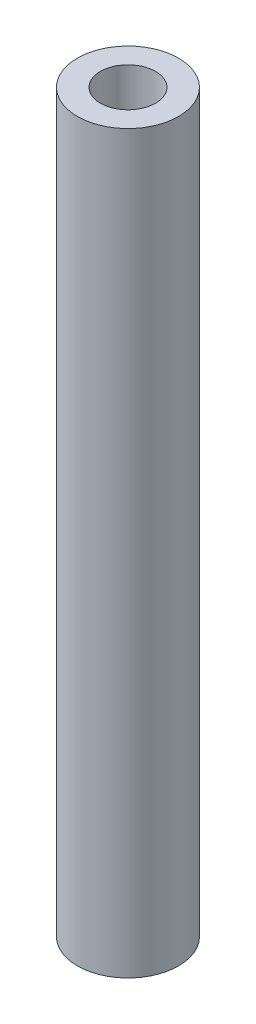
ISO-10303-21;
HEADER;
FILE_DESCRIPTION(('STEP AP214'),'2;1');
FILE_NAME('part.step','',(''),(''),'','','');
FILE_SCHEMA(('AUTOMOTIVE_DESIGN { 1 0 10303 214 1 1 1 1 }'));
ENDSEC;
DATA;
#1=APPLICATION_CONTEXT('core data for automotive mechanical design processes');
#2=APPLICATION_PROTOCOL_DEFINITION('international standard','automotive_design',2000,#1);
#3=PRODUCT_CONTEXT('',#1,'mechanical');
#4=PRODUCT('Part','Part','',(#3));
#5=PRODUCT_RELATED_PRODUCT_CATEGORY('part','',(#4));
#6=PRODUCT_DEFINITION_FORMATION('','',#4);
#7=PRODUCT_DEFINITION_CONTEXT('part definition',#1,'design');
#8=PRODUCT_DEFINITION('design','',#6,#7);
#9=PRODUCT_DEFINITION_SHAPE('','',#8);
#10=(LENGTH_UNIT() NAMED_UNIT(*) SI_UNIT(.MILLI.,.METRE.));
#11=(NAMED_UNIT(*) PLANE_ANGLE_UNIT() SI_UNIT($,.RADIAN.));
#12=(NAMED_UNIT(*) SI_UNIT($,.STERADIAN.) SOLID_ANGLE_UNIT());
#13=UNCERTAINTY_MEASURE_WITH_UNIT(LENGTH_MEASURE(1.E-05),#10,'distance_accuracy_value','');
#14=(GEOMETRIC_REPRESENTATION_CONTEXT(3) GLOBAL_UNCERTAINTY_ASSIGNED_CONTEXT((#13)) GLOBAL_UNIT_ASSIGNED_CONTEXT((#10,
#11,#12)) REPRESENTATION_CONTEXT('',''));
#15=CARTESIAN_POINT('',(0.,0.,0.));
#16=DIRECTION('',(0.,0.,1.));
#17=DIRECTION('',(1.,0.,0.));
#18=AXIS2_PLACEMENT_3D('',#15,#16,#17);
#19=CARTESIAN_POINT('',(0.,40.,0.));
#20=DIRECTION('',(0.,1.,0.));
#21=DIRECTION('',(0.,0.,1.));
#22=AXIS2_PLACEMENT_3D('',#19,#20,#21);
#23=PLANE('',#22);
#24=CARTESIAN_POINT('',(0.,40.,0.));
#25=DIRECTION('',(0.,1.,0.));
#26=DIRECTION('',(0.,0.,1.));
#27=AXIS2_PLACEMENT_3D('',#24,#25,#26);
#28=CIRCLE('',#27,2.75);
#29=CARTESIAN_POINT('',(0.,40.,2.75));
#30=VERTEX_POINT('',#29);
#31=EDGE_CURVE('E10',#30,#30,#28,.T.);
#32=ORIENTED_EDGE('',*,*,#31,.T.);
#33=EDGE_LOOP('',(#32));
#34=FACE_BOUND('',#33,.T.);
#35=CARTESIAN_POINT('',(0.,40.,0.));
#36=DIRECTION('',(0.,1.,0.));
#37=DIRECTION('',(0.,0.,1.));
#38=AXIS2_PLACEMENT_3D('',#35,#36,#37);
#39=CIRCLE('',#38,1.5);
#40=CARTESIAN_POINT('',(0.,40.,1.5));
#41=VERTEX_POINT('',#40);
#42=EDGE_CURVE('E54',#41,#41,#39,.T.);
#43=ORIENTED_EDGE('',*,*,#42,.F.);
#44=EDGE_LOOP('',(#43));
#45=FACE_BOUND('',#44,.T.);
#46=ADVANCED_FACE('F41',(#34,#45),#23,.T.);
#47=CARTESIAN_POINT('',(0.,0.,0.));
#48=DIRECTION('',(0.,1.,0.));
#49=DIRECTION('',(0.,0.,1.));
#50=AXIS2_PLACEMENT_3D('',#47,#48,#49);
#51=PLANE('',#50);
#52=CARTESIAN_POINT('',(0.,0.,0.));
#53=DIRECTION('',(0.,1.,0.));
#54=DIRECTION('',(0.,0.,1.));
#55=AXIS2_PLACEMENT_3D('',#52,#53,#54);
#56=CIRCLE('',#55,2.75);
#57=CARTESIAN_POINT('',(0.,0.,2.75));
#58=VERTEX_POINT('',#57);
#59=EDGE_CURVE('E45',#58,#58,#56,.T.);
#60=ORIENTED_EDGE('',*,*,#59,.F.);
#61=EDGE_LOOP('',(#60));
#62=FACE_BOUND('',#61,.T.);
#63=CARTESIAN_POINT('',(0.,0.,0.));
#64=DIRECTION('',(0.,1.,0.));
#65=DIRECTION('',(0.,0.,1.));
#66=AXIS2_PLACEMENT_3D('',#63,#64,#65);
#67=CIRCLE('',#66,1.5);
#68=CARTESIAN_POINT('',(0.,0.,1.5));
#69=VERTEX_POINT('',#68);
#70=EDGE_CURVE('E56',#69,#69,#67,.T.);
#71=ORIENTED_EDGE('',*,*,#70,.T.);
#72=EDGE_LOOP('',(#71));
#73=FACE_BOUND('',#72,.T.);
#74=ADVANCED_FACE('F68',(#62,#73),#51,.F.);
#75=CARTESIAN_POINT('',(0.,40.,0.));
#76=DIRECTION('',(0.,-1.,0.));
#77=DIRECTION('',(0.,0.,-1.));
#78=AXIS2_PLACEMENT_3D('',#75,#76,#77);
#79=CYLINDRICAL_SURFACE('',#78,2.75);
#80=ORIENTED_EDGE('',*,*,#31,.F.);
#81=EDGE_LOOP('',(#80));
#82=FACE_BOUND('',#81,.T.);
#83=ORIENTED_EDGE('',*,*,#59,.T.);
#84=EDGE_LOOP('',(#83));
#85=FACE_BOUND('',#84,.T.);
#86=ADVANCED_FACE('F43',(#82,#85),#79,.T.);
#87=CARTESIAN_POINT('',(0.,40.,0.));
#88=DIRECTION('',(0.,-1.,0.));
#89=DIRECTION('',(0.,0.,-1.));
#90=AXIS2_PLACEMENT_3D('',#87,#88,#89);
#91=CYLINDRICAL_SURFACE('',#90,1.5);
#92=ORIENTED_EDGE('',*,*,#42,.T.);
#93=EDGE_LOOP('',(#92));
#94=FACE_BOUND('',#93,.T.);
#95=ORIENTED_EDGE('',*,*,#70,.F.);
#96=EDGE_LOOP('',(#95));
#97=FACE_BOUND('',#96,.T.);
#98=ADVANCED_FACE('F64',(#94,#97),#91,.F.);
#99=CLOSED_SHELL('',(#46,#74,#86,#98));
#100=MANIFOLD_SOLID_BREP('B2',#99);
#101=ADVANCED_BREP_SHAPE_REPRESENTATION('',(#18,#100),#14);
#102=SHAPE_DEFINITION_REPRESENTATION(#9,#101);
ENDSEC;
END-ISO-10303-21;
